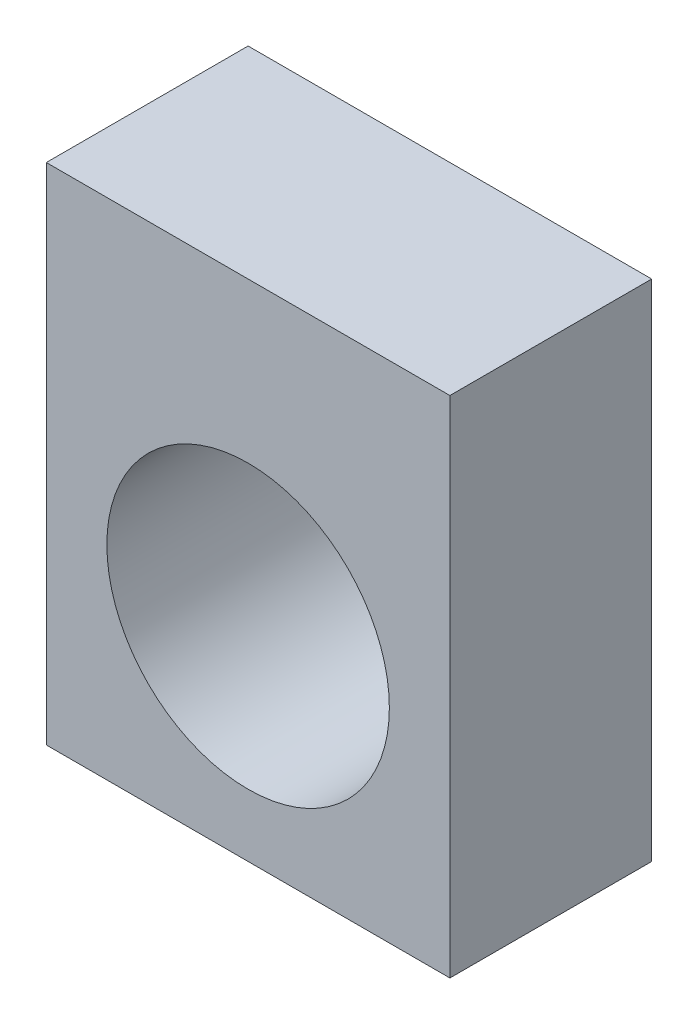
ISO-10303-21;
HEADER;
FILE_DESCRIPTION(('STEP AP214'),'2;1');
FILE_NAME('part.step','',(''),(''),'','','');
FILE_SCHEMA(('AUTOMOTIVE_DESIGN { 1 0 10303 214 1 1 1 1 }'));
ENDSEC;
DATA;
#1=APPLICATION_CONTEXT('core data for automotive mechanical design processes');
#2=APPLICATION_PROTOCOL_DEFINITION('international standard','automotive_design',2000,#1);
#3=PRODUCT_CONTEXT('',#1,'mechanical');
#4=PRODUCT('Part','Part','',(#3));
#5=PRODUCT_RELATED_PRODUCT_CATEGORY('part','',(#4));
#6=PRODUCT_DEFINITION_FORMATION('','',#4);
#7=PRODUCT_DEFINITION_CONTEXT('part definition',#1,'design');
#8=PRODUCT_DEFINITION('design','',#6,#7);
#9=PRODUCT_DEFINITION_SHAPE('','',#8);
#10=(LENGTH_UNIT() NAMED_UNIT(*) SI_UNIT(.MILLI.,.METRE.));
#11=(NAMED_UNIT(*) PLANE_ANGLE_UNIT() SI_UNIT($,.RADIAN.));
#12=(NAMED_UNIT(*) SI_UNIT($,.STERADIAN.) SOLID_ANGLE_UNIT());
#13=UNCERTAINTY_MEASURE_WITH_UNIT(LENGTH_MEASURE(1.E-05),#10,'distance_accuracy_value','');
#14=(GEOMETRIC_REPRESENTATION_CONTEXT(3) GLOBAL_UNCERTAINTY_ASSIGNED_CONTEXT((#13)) GLOBAL_UNIT_ASSIGNED_CONTEXT((#10,
#11,#12)) REPRESENTATION_CONTEXT('',''));
#15=CARTESIAN_POINT('',(0.,0.,0.));
#16=DIRECTION('',(0.,0.,1.));
#17=DIRECTION('',(1.,0.,0.));
#18=AXIS2_PLACEMENT_3D('',#15,#16,#17);
#19=CARTESIAN_POINT('',(0.,0.,10.));
#20=DIRECTION('',(1.,0.,0.));
#21=DIRECTION('',(0.,0.,-1.));
#22=AXIS2_PLACEMENT_3D('',#19,#20,#21);
#23=PLANE('',#22);
#24=DIRECTION('',(0.,-1.,0.));
#25=VECTOR('',#24,1.);
#26=CARTESIAN_POINT('',(0.,0.,0.));
#27=LINE('',#26,#25);
#28=CARTESIAN_POINT('',(0.,25.,0.));
#29=VERTEX_POINT('',#28);
#30=CARTESIAN_POINT('',(0.,0.,0.));
#31=VERTEX_POINT('',#30);
#32=EDGE_CURVE('E111',#29,#31,#27,.T.);
#33=ORIENTED_EDGE('',*,*,#32,.T.);
#34=DIRECTION('',(0.,0.,-1.));
#35=VECTOR('',#34,1.);
#36=CARTESIAN_POINT('',(0.,0.,10.));
#37=LINE('',#36,#35);
#38=CARTESIAN_POINT('',(0.,0.,10.));
#39=VERTEX_POINT('',#38);
#40=EDGE_CURVE('E11',#39,#31,#37,.T.);
#41=ORIENTED_EDGE('',*,*,#40,.F.);
#42=DIRECTION('',(0.,-1.,0.));
#43=VECTOR('',#42,1.);
#44=CARTESIAN_POINT('',(0.,0.,10.));
#45=LINE('',#44,#43);
#46=CARTESIAN_POINT('',(0.,25.,10.));
#47=VERTEX_POINT('',#46);
#48=EDGE_CURVE('E95',#47,#39,#45,.T.);
#49=ORIENTED_EDGE('',*,*,#48,.F.);
#50=DIRECTION('',(0.,0.,-1.));
#51=VECTOR('',#50,1.);
#52=CARTESIAN_POINT('',(0.,25.,10.));
#53=LINE('',#52,#51);
#54=EDGE_CURVE('E107',#47,#29,#53,.T.);
#55=ORIENTED_EDGE('',*,*,#54,.T.);
#56=EDGE_LOOP('',(#33,#41,#49,#55));
#57=FACE_BOUND('',#56,.T.);
#58=ADVANCED_FACE('F43',(#57),#23,.F.);
#59=CARTESIAN_POINT('',(0.,0.,10.));
#60=DIRECTION('',(0.,1.,0.));
#61=DIRECTION('',(0.,0.,1.));
#62=AXIS2_PLACEMENT_3D('',#59,#60,#61);
#63=PLANE('',#62);
#64=DIRECTION('',(1.,0.,0.));
#65=VECTOR('',#64,1.);
#66=CARTESIAN_POINT('',(0.,0.,0.));
#67=LINE('',#66,#65);
#68=CARTESIAN_POINT('',(20.,0.,0.));
#69=VERTEX_POINT('',#68);
#70=EDGE_CURVE('E100',#31,#69,#67,.T.);
#71=ORIENTED_EDGE('',*,*,#70,.T.);
#72=DIRECTION('',(0.,0.,-1.));
#73=VECTOR('',#72,1.);
#74=CARTESIAN_POINT('',(20.,0.,10.));
#75=LINE('',#74,#73);
#76=CARTESIAN_POINT('',(20.,0.,10.));
#77=VERTEX_POINT('',#76);
#78=EDGE_CURVE('E52',#77,#69,#75,.T.);
#79=ORIENTED_EDGE('',*,*,#78,.F.);
#80=DIRECTION('',(1.,0.,0.));
#81=VECTOR('',#80,1.);
#82=CARTESIAN_POINT('',(0.,0.,10.));
#83=LINE('',#82,#81);
#84=EDGE_CURVE('E90',#39,#77,#83,.T.);
#85=ORIENTED_EDGE('',*,*,#84,.F.);
#86=ORIENTED_EDGE('',*,*,#40,.T.);
#87=EDGE_LOOP('',(#71,#79,#85,#86));
#88=FACE_BOUND('',#87,.T.);
#89=ADVANCED_FACE('F99',(#88),#63,.F.);
#90=CARTESIAN_POINT('',(20.,0.,10.));
#91=DIRECTION('',(-1.,0.,0.));
#92=DIRECTION('',(0.,0.,1.));
#93=AXIS2_PLACEMENT_3D('',#90,#91,#92);
#94=PLANE('',#93);
#95=DIRECTION('',(0.,1.,0.));
#96=VECTOR('',#95,1.);
#97=CARTESIAN_POINT('',(20.,0.,0.));
#98=LINE('',#97,#96);
#99=CARTESIAN_POINT('',(20.,25.,0.));
#100=VERTEX_POINT('',#99);
#101=EDGE_CURVE('E77',#69,#100,#98,.T.);
#102=ORIENTED_EDGE('',*,*,#101,.T.);
#103=DIRECTION('',(0.,0.,-1.));
#104=VECTOR('',#103,1.);
#105=CARTESIAN_POINT('',(20.,25.,10.));
#106=LINE('',#105,#104);
#107=CARTESIAN_POINT('',(20.,25.,10.));
#108=VERTEX_POINT('',#107);
#109=EDGE_CURVE('E102',#108,#100,#106,.T.);
#110=ORIENTED_EDGE('',*,*,#109,.F.);
#111=DIRECTION('',(0.,1.,0.));
#112=VECTOR('',#111,1.);
#113=CARTESIAN_POINT('',(20.,0.,10.));
#114=LINE('',#113,#112);
#115=EDGE_CURVE('E93',#77,#108,#114,.T.);
#116=ORIENTED_EDGE('',*,*,#115,.F.);
#117=ORIENTED_EDGE('',*,*,#78,.T.);
#118=EDGE_LOOP('',(#102,#110,#116,#117));
#119=FACE_BOUND('',#118,.T.);
#120=ADVANCED_FACE('F103',(#119),#94,.F.);
#121=CARTESIAN_POINT('',(0.,25.,10.));
#122=DIRECTION('',(0.,-1.,0.));
#123=DIRECTION('',(0.,0.,-1.));
#124=AXIS2_PLACEMENT_3D('',#121,#122,#123);
#125=PLANE('',#124);
#126=DIRECTION('',(-1.,0.,0.));
#127=VECTOR('',#126,1.);
#128=CARTESIAN_POINT('',(0.,25.,0.));
#129=LINE('',#128,#127);
#130=EDGE_CURVE('E83',#100,#29,#129,.T.);
#131=ORIENTED_EDGE('',*,*,#130,.T.);
#132=ORIENTED_EDGE('',*,*,#54,.F.);
#133=DIRECTION('',(-1.,0.,0.));
#134=VECTOR('',#133,1.);
#135=CARTESIAN_POINT('',(0.,25.,10.));
#136=LINE('',#135,#134);
#137=EDGE_CURVE('E60',#108,#47,#136,.T.);
#138=ORIENTED_EDGE('',*,*,#137,.F.);
#139=ORIENTED_EDGE('',*,*,#109,.T.);
#140=EDGE_LOOP('',(#131,#132,#138,#139));
#141=FACE_BOUND('',#140,.T.);
#142=ADVANCED_FACE('F125',(#141),#125,.F.);
#143=CARTESIAN_POINT('',(0.,0.,10.));
#144=DIRECTION('',(0.,0.,-1.));
#145=DIRECTION('',(-1.,0.,0.));
#146=AXIS2_PLACEMENT_3D('',#143,#144,#145);
#147=PLANE('',#146);
#148=CARTESIAN_POINT('',(10.,10.1,10.));
#149=DIRECTION('',(0.,0.,1.));
#150=DIRECTION('',(1.,0.,0.));
#151=AXIS2_PLACEMENT_3D('',#148,#149,#150);
#152=CIRCLE('',#151,7.);
#153=CARTESIAN_POINT('',(17.,10.1,10.));
#154=VERTEX_POINT('',#153);
#155=EDGE_CURVE('E132',#154,#154,#152,.T.);
#156=ORIENTED_EDGE('',*,*,#155,.F.);
#157=EDGE_LOOP('',(#156));
#158=FACE_BOUND('',#157,.T.);
#159=ORIENTED_EDGE('',*,*,#48,.T.);
#160=ORIENTED_EDGE('',*,*,#84,.T.);
#161=ORIENTED_EDGE('',*,*,#115,.T.);
#162=ORIENTED_EDGE('',*,*,#137,.T.);
#163=EDGE_LOOP('',(#159,#160,#161,#162));
#164=FACE_BOUND('',#163,.T.);
#165=ADVANCED_FACE('F91',(#158,#164),#147,.F.);
#166=CARTESIAN_POINT('',(0.,0.,0.));
#167=DIRECTION('',(0.,0.,-1.));
#168=DIRECTION('',(-1.,0.,0.));
#169=AXIS2_PLACEMENT_3D('',#166,#167,#168);
#170=PLANE('',#169);
#171=CARTESIAN_POINT('',(10.,10.1,0.));
#172=DIRECTION('',(0.,0.,1.));
#173=DIRECTION('',(1.,0.,0.));
#174=AXIS2_PLACEMENT_3D('',#171,#172,#173);
#175=CIRCLE('',#174,7.);
#176=CARTESIAN_POINT('',(17.,10.1,0.));
#177=VERTEX_POINT('',#176);
#178=EDGE_CURVE('E115',#177,#177,#175,.T.);
#179=ORIENTED_EDGE('',*,*,#178,.T.);
#180=EDGE_LOOP('',(#179));
#181=FACE_BOUND('',#180,.T.);
#182=ORIENTED_EDGE('',*,*,#32,.F.);
#183=ORIENTED_EDGE('',*,*,#130,.F.);
#184=ORIENTED_EDGE('',*,*,#101,.F.);
#185=ORIENTED_EDGE('',*,*,#70,.F.);
#186=EDGE_LOOP('',(#182,#183,#184,#185));
#187=FACE_BOUND('',#186,.T.);
#188=ADVANCED_FACE('F128',(#181,#187),#170,.T.);
#189=CARTESIAN_POINT('',(10.,10.1,0.));
#190=DIRECTION('',(0.,0.,1.));
#191=DIRECTION('',(1.,0.,0.));
#192=AXIS2_PLACEMENT_3D('',#189,#190,#191);
#193=CYLINDRICAL_SURFACE('',#192,7.);
#194=ORIENTED_EDGE('',*,*,#178,.F.);
#195=EDGE_LOOP('',(#194));
#196=FACE_BOUND('',#195,.T.);
#197=ORIENTED_EDGE('',*,*,#155,.T.);
#198=EDGE_LOOP('',(#197));
#199=FACE_BOUND('',#198,.T.);
#200=ADVANCED_FACE('F141',(#196,#199),#193,.F.);
#201=CLOSED_SHELL('',(#58,#89,#120,#142,#165,#188,#200));
#202=MANIFOLD_SOLID_BREP('B2',#201);
#203=ADVANCED_BREP_SHAPE_REPRESENTATION('',(#18,#202),#14);
#204=SHAPE_DEFINITION_REPRESENTATION(#9,#203);
ENDSEC;
END-ISO-10303-21;
